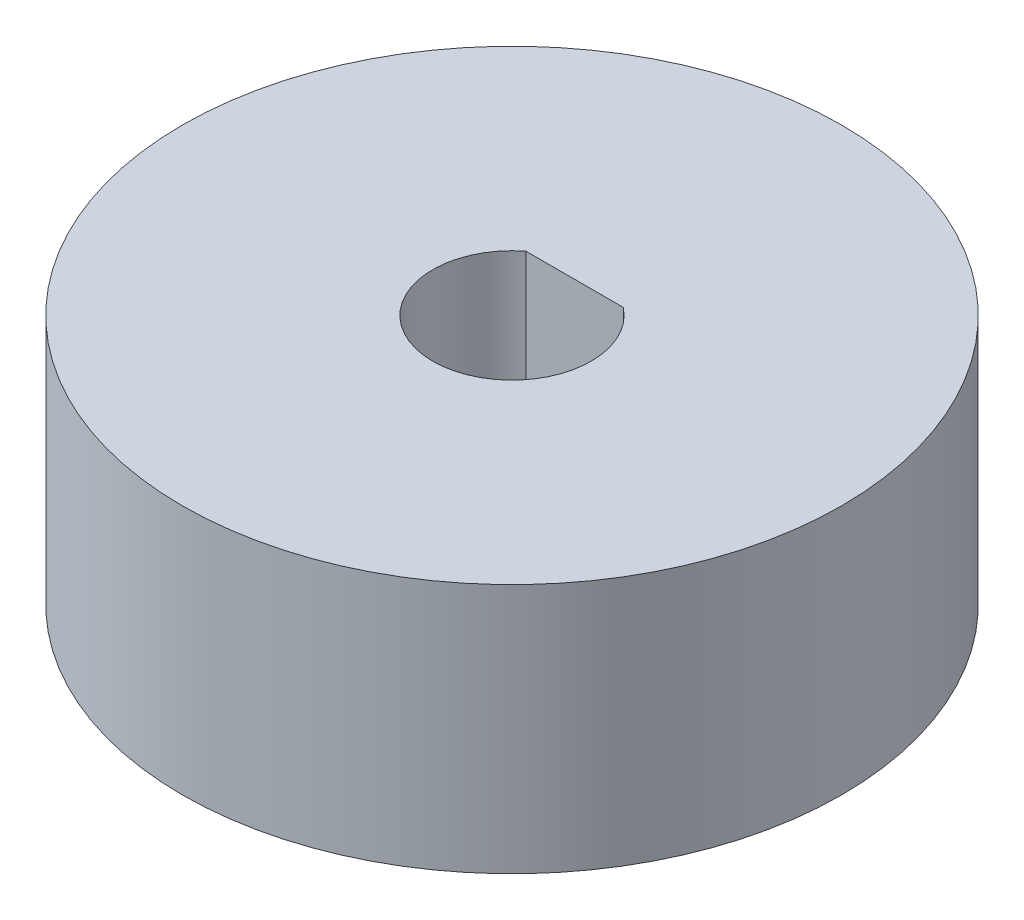
ISO-10303-21;
HEADER;
FILE_DESCRIPTION(('STEP AP214'),'2;1');
FILE_NAME('part.step','',(''),(''),'','','');
FILE_SCHEMA(('AUTOMOTIVE_DESIGN { 1 0 10303 214 1 1 1 1 }'));
ENDSEC;
DATA;
#1=APPLICATION_CONTEXT('core data for automotive mechanical design processes');
#2=APPLICATION_PROTOCOL_DEFINITION('international standard','automotive_design',2000,#1);
#3=PRODUCT_CONTEXT('',#1,'mechanical');
#4=PRODUCT('Part','Part','',(#3));
#5=PRODUCT_RELATED_PRODUCT_CATEGORY('part','',(#4));
#6=PRODUCT_DEFINITION_FORMATION('','',#4);
#7=PRODUCT_DEFINITION_CONTEXT('part definition',#1,'design');
#8=PRODUCT_DEFINITION('design','',#6,#7);
#9=PRODUCT_DEFINITION_SHAPE('','',#8);
#10=(LENGTH_UNIT() NAMED_UNIT(*) SI_UNIT(.MILLI.,.METRE.));
#11=(NAMED_UNIT(*) PLANE_ANGLE_UNIT() SI_UNIT($,.RADIAN.));
#12=(NAMED_UNIT(*) SI_UNIT($,.STERADIAN.) SOLID_ANGLE_UNIT());
#13=UNCERTAINTY_MEASURE_WITH_UNIT(LENGTH_MEASURE(1.E-05),#10,'distance_accuracy_value','');
#14=(GEOMETRIC_REPRESENTATION_CONTEXT(3) GLOBAL_UNCERTAINTY_ASSIGNED_CONTEXT((#13)) GLOBAL_UNIT_ASSIGNED_CONTEXT((#10,
#11,#12)) REPRESENTATION_CONTEXT('',''));
#15=CARTESIAN_POINT('',(0.,0.,0.));
#16=DIRECTION('',(0.,0.,1.));
#17=DIRECTION('',(1.,0.,0.));
#18=AXIS2_PLACEMENT_3D('',#15,#16,#17);
#19=CARTESIAN_POINT('',(0.,6.,0.));
#20=DIRECTION('',(0.,-1.,0.));
#21=DIRECTION('',(0.,0.,-1.));
#22=AXIS2_PLACEMENT_3D('',#19,#20,#21);
#23=CYLINDRICAL_SURFACE('',#22,1.9);
#24=CARTESIAN_POINT('',(0.,0.,0.));
#25=DIRECTION('',(0.,1.,0.));
#26=DIRECTION('',(0.,0.,1.));
#27=AXIS2_PLACEMENT_3D('',#24,#25,#26);
#28=CIRCLE('',#27,1.9);
#29=CARTESIAN_POINT('',(-1.16619037896906,0.,-1.5));
#30=VERTEX_POINT('',#29);
#31=CARTESIAN_POINT('',(1.16619037896906,0.,-1.5));
#32=VERTEX_POINT('',#31);
#33=EDGE_CURVE('E77',#30,#32,#28,.T.);
#34=ORIENTED_EDGE('',*,*,#33,.F.);
#35=DIRECTION('',(0.,-1.,0.));
#36=VECTOR('',#35,1.);
#37=CARTESIAN_POINT('',(-1.16619037896906,6.,-1.5));
#38=LINE('',#37,#36);
#39=CARTESIAN_POINT('',(-1.16619037896906,6.,-1.5));
#40=VERTEX_POINT('',#39);
#41=EDGE_CURVE('E12',#40,#30,#38,.T.);
#42=ORIENTED_EDGE('',*,*,#41,.F.);
#43=CARTESIAN_POINT('',(0.,6.,0.));
#44=DIRECTION('',(0.,1.,0.));
#45=DIRECTION('',(0.,0.,1.));
#46=AXIS2_PLACEMENT_3D('',#43,#44,#45);
#47=CIRCLE('',#46,1.9);
#48=CARTESIAN_POINT('',(1.16619037896906,6.,-1.5));
#49=VERTEX_POINT('',#48);
#50=EDGE_CURVE('E78',#40,#49,#47,.T.);
#51=ORIENTED_EDGE('',*,*,#50,.T.);
#52=DIRECTION('',(0.,-1.,0.));
#53=VECTOR('',#52,1.);
#54=CARTESIAN_POINT('',(1.16619037896906,6.,-1.5));
#55=LINE('',#54,#53);
#56=EDGE_CURVE('E57',#49,#32,#55,.T.);
#57=ORIENTED_EDGE('',*,*,#56,.T.);
#58=EDGE_LOOP('',(#34,#42,#51,#57));
#59=FACE_BOUND('',#58,.T.);
#60=ADVANCED_FACE('F48',(#59),#23,.F.);
#61=CARTESIAN_POINT('',(0.,6.,-1.5));
#62=DIRECTION('',(0.,0.,-1.));
#63=DIRECTION('',(-1.,0.,0.));
#64=AXIS2_PLACEMENT_3D('',#61,#62,#63);
#65=PLANE('',#64);
#66=DIRECTION('',(1.,0.,0.));
#67=VECTOR('',#66,1.);
#68=CARTESIAN_POINT('',(0.,0.,-1.5));
#69=LINE('',#68,#67);
#70=EDGE_CURVE('E81',#30,#32,#69,.T.);
#71=ORIENTED_EDGE('',*,*,#70,.T.);
#72=ORIENTED_EDGE('',*,*,#56,.F.);
#73=DIRECTION('',(1.,0.,0.));
#74=VECTOR('',#73,1.);
#75=CARTESIAN_POINT('',(0.,6.,-1.5));
#76=LINE('',#75,#74);
#77=EDGE_CURVE('E64',#40,#49,#76,.T.);
#78=ORIENTED_EDGE('',*,*,#77,.F.);
#79=ORIENTED_EDGE('',*,*,#41,.T.);
#80=EDGE_LOOP('',(#71,#72,#78,#79));
#81=FACE_BOUND('',#80,.T.);
#82=ADVANCED_FACE('F82',(#81),#65,.F.);
#83=CARTESIAN_POINT('',(0.,6.,0.));
#84=DIRECTION('',(0.,-1.,0.));
#85=DIRECTION('',(0.,0.,-1.));
#86=AXIS2_PLACEMENT_3D('',#83,#84,#85);
#87=CYLINDRICAL_SURFACE('',#86,7.9);
#88=CARTESIAN_POINT('',(0.,6.,0.));
#89=DIRECTION('',(0.,1.,0.));
#90=DIRECTION('',(0.,0.,1.));
#91=AXIS2_PLACEMENT_3D('',#88,#89,#90);
#92=CIRCLE('',#91,7.9);
#93=CARTESIAN_POINT('',(0.,6.,7.9));
#94=VERTEX_POINT('',#93);
#95=EDGE_CURVE('E80',#94,#94,#92,.T.);
#96=ORIENTED_EDGE('',*,*,#95,.F.);
#97=EDGE_LOOP('',(#96));
#98=FACE_BOUND('',#97,.T.);
#99=CARTESIAN_POINT('',(0.,0.,0.));
#100=DIRECTION('',(0.,1.,0.));
#101=DIRECTION('',(0.,0.,1.));
#102=AXIS2_PLACEMENT_3D('',#99,#100,#101);
#103=CIRCLE('',#102,7.9);
#104=CARTESIAN_POINT('',(0.,0.,7.9));
#105=VERTEX_POINT('',#104);
#106=EDGE_CURVE('E85',#105,#105,#103,.T.);
#107=ORIENTED_EDGE('',*,*,#106,.T.);
#108=EDGE_LOOP('',(#107));
#109=FACE_BOUND('',#108,.T.);
#110=ADVANCED_FACE('F110',(#98,#109),#87,.T.);
#111=CARTESIAN_POINT('',(0.,6.,0.));
#112=DIRECTION('',(0.,1.,0.));
#113=DIRECTION('',(0.,0.,1.));
#114=AXIS2_PLACEMENT_3D('',#111,#112,#113);
#115=PLANE('',#114);
#116=ORIENTED_EDGE('',*,*,#50,.F.);
#117=ORIENTED_EDGE('',*,*,#77,.T.);
#118=EDGE_LOOP('',(#116,#117));
#119=FACE_BOUND('',#118,.T.);
#120=ORIENTED_EDGE('',*,*,#95,.T.);
#121=EDGE_LOOP('',(#120));
#122=FACE_BOUND('',#121,.T.);
#123=ADVANCED_FACE('F108',(#119,#122),#115,.T.);
#124=CARTESIAN_POINT('',(0.,0.,0.));
#125=DIRECTION('',(0.,1.,0.));
#126=DIRECTION('',(0.,0.,1.));
#127=AXIS2_PLACEMENT_3D('',#124,#125,#126);
#128=PLANE('',#127);
#129=ORIENTED_EDGE('',*,*,#33,.T.);
#130=ORIENTED_EDGE('',*,*,#70,.F.);
#131=EDGE_LOOP('',(#129,#130));
#132=FACE_BOUND('',#131,.T.);
#133=ORIENTED_EDGE('',*,*,#106,.F.);
#134=EDGE_LOOP('',(#133));
#135=FACE_BOUND('',#134,.T.);
#136=ADVANCED_FACE('F87',(#132,#135),#128,.F.);
#137=CLOSED_SHELL('',(#60,#82,#110,#123,#136));
#138=MANIFOLD_SOLID_BREP('B2',#137);
#139=ADVANCED_BREP_SHAPE_REPRESENTATION('',(#18,#138),#14);
#140=SHAPE_DEFINITION_REPRESENTATION(#9,#139);
ENDSEC;
END-ISO-10303-21;
